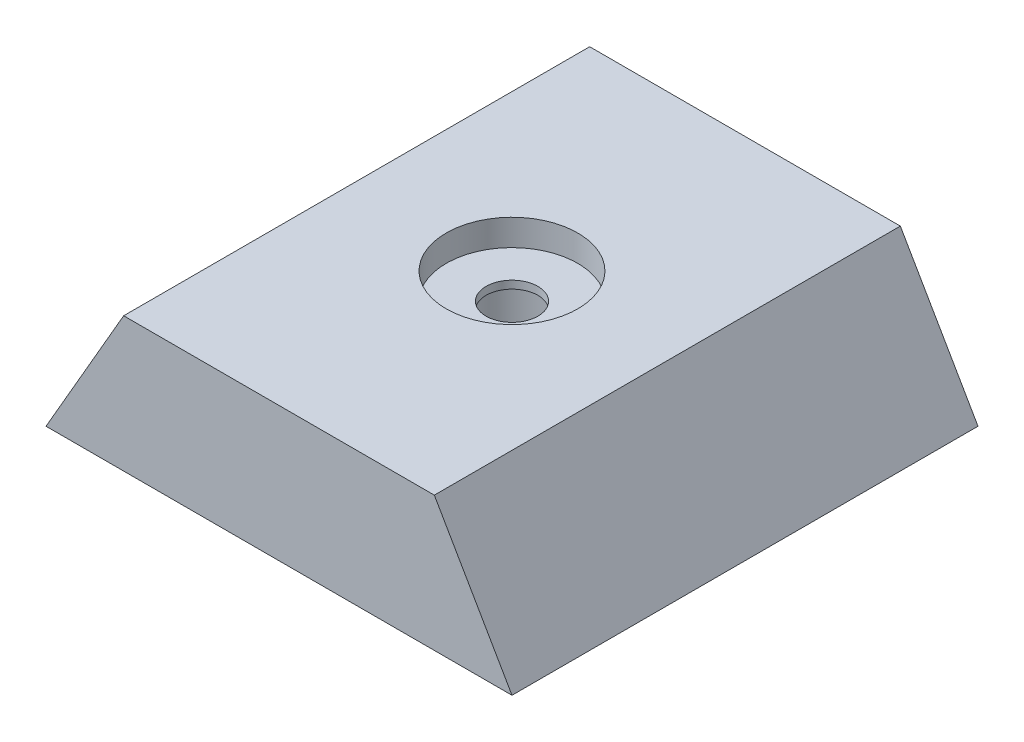
ISO-10303-21;
HEADER;
FILE_DESCRIPTION(('STEP AP214'),'2;1');
FILE_NAME('part.step','',(''),(''),'','','');
FILE_SCHEMA(('AUTOMOTIVE_DESIGN { 1 0 10303 214 1 1 1 1 }'));
ENDSEC;
DATA;
#1=APPLICATION_CONTEXT('core data for automotive mechanical design processes');
#2=APPLICATION_PROTOCOL_DEFINITION('international standard','automotive_design',2000,#1);
#3=PRODUCT_CONTEXT('',#1,'mechanical');
#4=PRODUCT('Part','Part','',(#3));
#5=PRODUCT_RELATED_PRODUCT_CATEGORY('part','',(#4));
#6=PRODUCT_DEFINITION_FORMATION('','',#4);
#7=PRODUCT_DEFINITION_CONTEXT('part definition',#1,'design');
#8=PRODUCT_DEFINITION('design','',#6,#7);
#9=PRODUCT_DEFINITION_SHAPE('','',#8);
#10=(LENGTH_UNIT() NAMED_UNIT(*) SI_UNIT(.MILLI.,.METRE.));
#11=(NAMED_UNIT(*) PLANE_ANGLE_UNIT() SI_UNIT($,.RADIAN.));
#12=(NAMED_UNIT(*) SI_UNIT($,.STERADIAN.) SOLID_ANGLE_UNIT());
#13=UNCERTAINTY_MEASURE_WITH_UNIT(LENGTH_MEASURE(1.E-05),#10,'distance_accuracy_value','');
#14=(GEOMETRIC_REPRESENTATION_CONTEXT(3) GLOBAL_UNCERTAINTY_ASSIGNED_CONTEXT((#13)) GLOBAL_UNIT_ASSIGNED_CONTEXT((#10,
#11,#12)) REPRESENTATION_CONTEXT('',''));
#15=CARTESIAN_POINT('',(0.,0.,0.));
#16=DIRECTION('',(0.,0.,1.));
#17=DIRECTION('',(1.,0.,0.));
#18=AXIS2_PLACEMENT_3D('',#15,#16,#17);
#19=CARTESIAN_POINT('',(0.,0.,450.));
#20=DIRECTION('',(0.,1.,0.));
#21=DIRECTION('',(0.,0.,1.));
#22=AXIS2_PLACEMENT_3D('',#19,#20,#21);
#23=PLANE('',#22);
#24=DIRECTION('',(1.,0.,0.));
#25=VECTOR('',#24,1.);
#26=CARTESIAN_POINT('',(0.,0.,0.));
#27=LINE('',#26,#25);
#28=CARTESIAN_POINT('',(0.,0.,0.));
#29=VERTEX_POINT('',#28);
#30=CARTESIAN_POINT('',(450.,0.,0.));
#31=VERTEX_POINT('',#30);
#32=EDGE_CURVE('E214',#29,#31,#27,.T.);
#33=ORIENTED_EDGE('',*,*,#32,.T.);
#34=DIRECTION('',(0.,0.,-1.));
#35=VECTOR('',#34,1.);
#36=CARTESIAN_POINT('',(450.,0.,450.));
#37=LINE('',#36,#35);
#38=CARTESIAN_POINT('',(450.,0.,450.));
#39=VERTEX_POINT('',#38);
#40=EDGE_CURVE('E51',#39,#31,#37,.T.);
#41=ORIENTED_EDGE('',*,*,#40,.F.);
#42=DIRECTION('',(1.,0.,0.));
#43=VECTOR('',#42,1.);
#44=CARTESIAN_POINT('',(0.,0.,450.));
#45=LINE('',#44,#43);
#46=CARTESIAN_POINT('',(0.,0.,450.));
#47=VERTEX_POINT('',#46);
#48=EDGE_CURVE('E95',#47,#39,#45,.T.);
#49=ORIENTED_EDGE('',*,*,#48,.F.);
#50=DIRECTION('',(0.,0.,-1.));
#51=VECTOR('',#50,1.);
#52=CARTESIAN_POINT('',(0.,0.,450.));
#53=LINE('',#52,#51);
#54=EDGE_CURVE('E11',#47,#29,#53,.T.);
#55=ORIENTED_EDGE('',*,*,#54,.T.);
#56=EDGE_LOOP('',(#33,#41,#49,#55));
#57=FACE_BOUND('',#56,.T.);
#58=DIRECTION('',(1.,0.,0.));
#59=VECTOR('',#58,1.);
#60=CARTESIAN_POINT('',(0.,0.,30.));
#61=LINE('',#60,#59);
#62=CARTESIAN_POINT('',(34.6410161513777,0.,30.));
#63=VERTEX_POINT('',#62);
#64=CARTESIAN_POINT('',(415.358983848623,0.,30.));
#65=VERTEX_POINT('',#64);
#66=EDGE_CURVE('E142',#63,#65,#61,.T.);
#67=ORIENTED_EDGE('',*,*,#66,.F.);
#68=DIRECTION('',(0.,0.,-1.));
#69=VECTOR('',#68,1.);
#70=CARTESIAN_POINT('',(34.6410161513777,0.,450.));
#71=LINE('',#70,#69);
#72=CARTESIAN_POINT('',(34.6410161513777,0.,420.));
#73=VERTEX_POINT('',#72);
#74=EDGE_CURVE('E140',#73,#63,#71,.T.);
#75=ORIENTED_EDGE('',*,*,#74,.F.);
#76=DIRECTION('',(1.,0.,0.));
#77=VECTOR('',#76,1.);
#78=CARTESIAN_POINT('',(0.,0.,420.));
#79=LINE('',#78,#77);
#80=CARTESIAN_POINT('',(415.358983848623,0.,420.));
#81=VERTEX_POINT('',#80);
#82=EDGE_CURVE('E156',#73,#81,#79,.T.);
#83=ORIENTED_EDGE('',*,*,#82,.T.);
#84=DIRECTION('',(0.,0.,-1.));
#85=VECTOR('',#84,1.);
#86=CARTESIAN_POINT('',(415.358983848623,0.,450.));
#87=LINE('',#86,#85);
#88=EDGE_CURVE('E164',#81,#65,#87,.T.);
#89=ORIENTED_EDGE('',*,*,#88,.T.);
#90=EDGE_LOOP('',(#67,#75,#83,#89));
#91=FACE_BOUND('',#90,.T.);
#92=ADVANCED_FACE('F41',(#57,#91),#23,.F.);
#93=CARTESIAN_POINT('',(225.,84.5038105676655,225.));
#94=DIRECTION('',(0.,1.,0.));
#95=DIRECTION('',(0.,0.,1.));
#96=AXIS2_PLACEMENT_3D('',#93,#94,#95);
#97=CYLINDRICAL_SURFACE('',#96,25.);
#98=CARTESIAN_POINT('',(225.,104.503810567665,225.));
#99=DIRECTION('',(0.,1.,0.));
#100=DIRECTION('',(0.,0.,1.));
#101=AXIS2_PLACEMENT_3D('',#98,#99,#100);
#102=CIRCLE('',#101,25.);
#103=CARTESIAN_POINT('',(225.,104.503810567665,250.));
#104=VERTEX_POINT('',#103);
#105=EDGE_CURVE('E187',#104,#104,#102,.T.);
#106=ORIENTED_EDGE('',*,*,#105,.T.);
#107=EDGE_LOOP('',(#106));
#108=FACE_BOUND('',#107,.T.);
#109=CARTESIAN_POINT('',(225.,97.,225.));
#110=DIRECTION('',(0.,-1.,0.));
#111=DIRECTION('',(0.,0.,-1.));
#112=AXIS2_PLACEMENT_3D('',#109,#110,#111);
#113=CIRCLE('',#112,25.);
#114=CARTESIAN_POINT('',(225.,97.,200.));
#115=VERTEX_POINT('',#114);
#116=EDGE_CURVE('E45',#115,#115,#113,.F.);
#117=ORIENTED_EDGE('',*,*,#116,.F.);
#118=EDGE_LOOP('',(#117));
#119=FACE_BOUND('',#118,.T.);
#120=ADVANCED_FACE('F255',(#108,#119),#97,.F.);
#121=CARTESIAN_POINT('',(75.0000000000006,129.903810567665,450.));
#122=DIRECTION('',(0.866025403784437,-0.500000000000004,0.));
#123=DIRECTION('',(0.500000000000004,0.866025403784437,0.));
#124=AXIS2_PLACEMENT_3D('',#121,#122,#123);
#125=PLANE('',#124);
#126=DIRECTION('',(-0.500000000000004,-0.866025403784436,0.));
#127=VECTOR('',#126,1.);
#128=CARTESIAN_POINT('',(75.0000000000006,129.903810567665,0.));
#129=LINE('',#128,#127);
#130=CARTESIAN_POINT('',(75.0000000000006,129.903810567665,0.));
#131=VERTEX_POINT('',#130);
#132=EDGE_CURVE('E196',#131,#29,#129,.T.);
#133=ORIENTED_EDGE('',*,*,#132,.T.);
#134=ORIENTED_EDGE('',*,*,#54,.F.);
#135=DIRECTION('',(-0.500000000000004,-0.866025403784436,0.));
#136=VECTOR('',#135,1.);
#137=CARTESIAN_POINT('',(75.0000000000006,129.903810567665,450.));
#138=LINE('',#137,#136);
#139=CARTESIAN_POINT('',(75.0000000000006,129.903810567665,450.));
#140=VERTEX_POINT('',#139);
#141=EDGE_CURVE('E200',#140,#47,#138,.T.);
#142=ORIENTED_EDGE('',*,*,#141,.F.);
#143=DIRECTION('',(0.,0.,-1.));
#144=VECTOR('',#143,1.);
#145=CARTESIAN_POINT('',(75.0000000000006,129.903810567665,450.));
#146=LINE('',#145,#144);
#147=EDGE_CURVE('E210',#140,#131,#146,.T.);
#148=ORIENTED_EDGE('',*,*,#147,.T.);
#149=EDGE_LOOP('',(#133,#134,#142,#148));
#150=FACE_BOUND('',#149,.T.);
#151=ADVANCED_FACE('F43',(#150),#125,.F.);
#152=CARTESIAN_POINT('',(225.,0.,225.));
#153=DIRECTION('',(0.,1.,0.));
#154=DIRECTION('',(0.,0.,1.));
#155=AXIS2_PLACEMENT_3D('',#152,#153,#154);
#156=CIRCLE('',#155,80.);
#157=CARTESIAN_POINT('',(225.,0.,145.));
#158=VERTEX_POINT('',#157);
#159=EDGE_CURVE('E172',#158,#158,#156,.F.);
#160=ORIENTED_EDGE('',*,*,#159,.T.);
#161=EDGE_LOOP('',(#160));
#162=FACE_BOUND('',#161,.T.);
#163=CARTESIAN_POINT('',(225.,0.,225.));
#164=DIRECTION('',(0.,-1.,0.));
#165=DIRECTION('',(0.,0.,-1.));
#166=AXIS2_PLACEMENT_3D('',#163,#164,#165);
#167=CIRCLE('',#166,50.);
#168=CARTESIAN_POINT('',(225.,0.,175.));
#169=VERTEX_POINT('',#168);
#170=EDGE_CURVE('E179',#169,#169,#167,.T.);
#171=ORIENTED_EDGE('',*,*,#170,.F.);
#172=EDGE_LOOP('',(#171));
#173=FACE_BOUND('',#172,.T.);
#174=ADVANCED_FACE('F250',(#162,#173),#23,.F.);
#175=CARTESIAN_POINT('',(375.000000000001,129.903810567665,450.));
#176=DIRECTION('',(-0.86602540378444,-0.499999999999998,0.));
#177=DIRECTION('',(0.499999999999998,-0.86602540378444,0.));
#178=AXIS2_PLACEMENT_3D('',#175,#176,#177);
#179=PLANE('',#178);
#180=DIRECTION('',(-0.499999999999998,0.86602540378444,0.));
#181=VECTOR('',#180,1.);
#182=CARTESIAN_POINT('',(375.000000000001,129.903810567665,0.));
#183=LINE('',#182,#181);
#184=CARTESIAN_POINT('',(375.000000000001,129.903810567665,0.));
#185=VERTEX_POINT('',#184);
#186=EDGE_CURVE('E217',#31,#185,#183,.T.);
#187=ORIENTED_EDGE('',*,*,#186,.T.);
#188=DIRECTION('',(0.,0.,-1.));
#189=VECTOR('',#188,1.);
#190=CARTESIAN_POINT('',(375.000000000001,129.903810567665,450.));
#191=LINE('',#190,#189);
#192=CARTESIAN_POINT('',(375.000000000001,129.903810567665,450.));
#193=VERTEX_POINT('',#192);
#194=EDGE_CURVE('E224',#193,#185,#191,.T.);
#195=ORIENTED_EDGE('',*,*,#194,.F.);
#196=DIRECTION('',(-0.499999999999998,0.86602540378444,0.));
#197=VECTOR('',#196,1.);
#198=CARTESIAN_POINT('',(375.000000000001,129.903810567665,450.));
#199=LINE('',#198,#197);
#200=EDGE_CURVE('E205',#39,#193,#199,.T.);
#201=ORIENTED_EDGE('',*,*,#200,.F.);
#202=ORIENTED_EDGE('',*,*,#40,.T.);
#203=EDGE_LOOP('',(#187,#195,#201,#202));
#204=FACE_BOUND('',#203,.T.);
#205=ADVANCED_FACE('F232',(#204),#179,.F.);
#206=CARTESIAN_POINT('',(75.0000000000006,129.903810567665,450.));
#207=DIRECTION('',(0.,-1.,0.));
#208=DIRECTION('',(1.,0.,0.));
#209=AXIS2_PLACEMENT_3D('',#206,#207,#208);
#210=PLANE('',#209);
#211=CARTESIAN_POINT('',(225.,129.903810567665,225.));
#212=DIRECTION('',(0.,1.,0.));
#213=DIRECTION('',(0.,0.,1.));
#214=AXIS2_PLACEMENT_3D('',#211,#212,#213);
#215=CIRCLE('',#214,63.5);
#216=CARTESIAN_POINT('',(225.,129.903810567665,288.5));
#217=VERTEX_POINT('',#216);
#218=EDGE_CURVE('E191',#217,#217,#215,.T.);
#219=ORIENTED_EDGE('',*,*,#218,.F.);
#220=EDGE_LOOP('',(#219));
#221=FACE_BOUND('',#220,.T.);
#222=DIRECTION('',(-1.,0.,0.));
#223=VECTOR('',#222,1.);
#224=CARTESIAN_POINT('',(75.0000000000006,129.903810567665,0.));
#225=LINE('',#224,#223);
#226=EDGE_CURVE('E88',#185,#131,#225,.T.);
#227=ORIENTED_EDGE('',*,*,#226,.T.);
#228=ORIENTED_EDGE('',*,*,#147,.F.);
#229=DIRECTION('',(-1.,0.,0.));
#230=VECTOR('',#229,1.);
#231=CARTESIAN_POINT('',(75.0000000000006,129.903810567665,450.));
#232=LINE('',#231,#230);
#233=EDGE_CURVE('E67',#193,#140,#232,.T.);
#234=ORIENTED_EDGE('',*,*,#233,.F.);
#235=ORIENTED_EDGE('',*,*,#194,.T.);
#236=EDGE_LOOP('',(#227,#228,#234,#235));
#237=FACE_BOUND('',#236,.T.);
#238=ADVANCED_FACE('F240',(#221,#237),#210,.F.);
#239=CARTESIAN_POINT('',(0.,0.,450.));
#240=DIRECTION('',(0.,0.,1.));
#241=DIRECTION('',(1.,0.,0.));
#242=AXIS2_PLACEMENT_3D('',#239,#240,#241);
#243=PLANE('',#242);
#244=ORIENTED_EDGE('',*,*,#141,.T.);
#245=ORIENTED_EDGE('',*,*,#48,.T.);
#246=ORIENTED_EDGE('',*,*,#200,.T.);
#247=ORIENTED_EDGE('',*,*,#233,.T.);
#248=EDGE_LOOP('',(#244,#245,#246,#247));
#249=FACE_BOUND('',#248,.T.);
#250=ADVANCED_FACE('F242',(#249),#243,.T.);
#251=CARTESIAN_POINT('',(0.,0.,0.));
#252=DIRECTION('',(0.,0.,1.));
#253=DIRECTION('',(1.,0.,0.));
#254=AXIS2_PLACEMENT_3D('',#251,#252,#253);
#255=PLANE('',#254);
#256=ORIENTED_EDGE('',*,*,#132,.F.);
#257=ORIENTED_EDGE('',*,*,#226,.F.);
#258=ORIENTED_EDGE('',*,*,#186,.F.);
#259=ORIENTED_EDGE('',*,*,#32,.F.);
#260=EDGE_LOOP('',(#256,#257,#258,#259));
#261=FACE_BOUND('',#260,.T.);
#262=ADVANCED_FACE('F236',(#261),#255,.F.);
#263=CARTESIAN_POINT('',(225.,104.503810567665,225.));
#264=DIRECTION('',(0.,1.,0.));
#265=DIRECTION('',(0.,0.,1.));
#266=AXIS2_PLACEMENT_3D('',#263,#264,#265);
#267=CYLINDRICAL_SURFACE('',#266,63.5);
#268=CARTESIAN_POINT('',(225.,104.503810567665,225.));
#269=DIRECTION('',(0.,1.,0.));
#270=DIRECTION('',(0.,0.,1.));
#271=AXIS2_PLACEMENT_3D('',#268,#269,#270);
#272=CIRCLE('',#271,63.5);
#273=CARTESIAN_POINT('',(225.,104.503810567665,288.5));
#274=VERTEX_POINT('',#273);
#275=EDGE_CURVE('E192',#274,#274,#272,.T.);
#276=ORIENTED_EDGE('',*,*,#275,.F.);
#277=EDGE_LOOP('',(#276));
#278=FACE_BOUND('',#277,.T.);
#279=ORIENTED_EDGE('',*,*,#218,.T.);
#280=EDGE_LOOP('',(#279));
#281=FACE_BOUND('',#280,.T.);
#282=ADVANCED_FACE('F290',(#278,#281),#267,.F.);
#283=CARTESIAN_POINT('',(225.,104.503810567665,225.));
#284=DIRECTION('',(0.,1.,0.));
#285=DIRECTION('',(0.,0.,1.));
#286=AXIS2_PLACEMENT_3D('',#283,#284,#285);
#287=PLANE('',#286);
#288=ORIENTED_EDGE('',*,*,#105,.F.);
#289=EDGE_LOOP('',(#288));
#290=FACE_BOUND('',#289,.T.);
#291=ORIENTED_EDGE('',*,*,#275,.T.);
#292=EDGE_LOOP('',(#291));
#293=FACE_BOUND('',#292,.T.);
#294=ADVANCED_FACE('F283',(#290,#293),#287,.T.);
#295=CARTESIAN_POINT('',(225.,97.,225.));
#296=DIRECTION('',(0.,-1.,0.));
#297=DIRECTION('',(0.,0.,-1.));
#298=AXIS2_PLACEMENT_3D('',#295,#296,#297);
#299=PLANE('',#298);
#300=CARTESIAN_POINT('',(225.,97.,225.));
#301=DIRECTION('',(0.,-1.,0.));
#302=DIRECTION('',(0.,0.,-1.));
#303=AXIS2_PLACEMENT_3D('',#300,#301,#302);
#304=CIRCLE('',#303,50.);
#305=CARTESIAN_POINT('',(225.,97.,175.));
#306=VERTEX_POINT('',#305);
#307=EDGE_CURVE('E180',#306,#306,#304,.T.);
#308=ORIENTED_EDGE('',*,*,#307,.T.);
#309=EDGE_LOOP('',(#308));
#310=FACE_BOUND('',#309,.T.);
#311=ORIENTED_EDGE('',*,*,#116,.T.);
#312=EDGE_LOOP('',(#311));
#313=FACE_BOUND('',#312,.T.);
#314=ADVANCED_FACE('F274',(#310,#313),#299,.T.);
#315=CARTESIAN_POINT('',(225.,97.,225.));
#316=DIRECTION('',(0.,-1.,0.));
#317=DIRECTION('',(0.,0.,-1.));
#318=AXIS2_PLACEMENT_3D('',#315,#316,#317);
#319=CYLINDRICAL_SURFACE('',#318,50.);
#320=CARTESIAN_POINT('',(225.,97.,175.));
#321=CARTESIAN_POINT('',(225.,95.9895833333334,175.));
#322=CARTESIAN_POINT('',(225.,94.9791666666667,175.));
#323=CARTESIAN_POINT('',(225.,92.9583333333333,175.));
#324=CARTESIAN_POINT('',(225.,91.9479166666667,175.));
#325=CARTESIAN_POINT('',(225.,89.9270833333333,175.));
#326=CARTESIAN_POINT('',(225.,88.9166666666667,175.));
#327=CARTESIAN_POINT('',(225.,86.8958333333333,175.));
#328=CARTESIAN_POINT('',(225.,85.8854166666667,175.));
#329=CARTESIAN_POINT('',(225.,83.8645833333333,175.));
#330=CARTESIAN_POINT('',(225.,82.8541666666667,175.));
#331=CARTESIAN_POINT('',(225.,80.8333333333333,175.));
#332=CARTESIAN_POINT('',(225.,79.8229166666667,175.));
#333=CARTESIAN_POINT('',(225.,77.8020833333333,175.));
#334=CARTESIAN_POINT('',(225.,76.7916666666667,175.));
#335=CARTESIAN_POINT('',(225.,74.7708333333333,175.));
#336=CARTESIAN_POINT('',(225.,73.7604166666667,175.));
#337=CARTESIAN_POINT('',(225.,71.7395833333333,175.));
#338=CARTESIAN_POINT('',(225.,70.7291666666667,175.));
#339=CARTESIAN_POINT('',(225.,68.7083333333333,175.));
#340=CARTESIAN_POINT('',(225.,67.6979166666667,175.));
#341=CARTESIAN_POINT('',(225.,65.6770833333333,175.));
#342=CARTESIAN_POINT('',(225.,64.6666666666667,175.));
#343=CARTESIAN_POINT('',(225.,62.6458333333333,175.));
#344=CARTESIAN_POINT('',(225.,61.6354166666667,175.));
#345=CARTESIAN_POINT('',(225.,59.6145833333333,175.));
#346=CARTESIAN_POINT('',(225.,58.6041666666667,175.));
#347=CARTESIAN_POINT('',(225.,56.5833333333333,175.));
#348=CARTESIAN_POINT('',(225.,55.5729166666667,175.));
#349=CARTESIAN_POINT('',(225.,53.5520833333333,175.));
#350=CARTESIAN_POINT('',(225.,52.5416666666667,175.));
#351=CARTESIAN_POINT('',(225.,50.5208333333333,175.));
#352=CARTESIAN_POINT('',(225.,49.5104166666667,175.));
#353=CARTESIAN_POINT('',(225.,47.4895833333333,175.));
#354=CARTESIAN_POINT('',(225.,46.4791666666667,175.));
#355=CARTESIAN_POINT('',(225.,44.4583333333333,175.));
#356=CARTESIAN_POINT('',(225.,43.4479166666667,175.));
#357=CARTESIAN_POINT('',(225.,41.4270833333333,175.));
#358=CARTESIAN_POINT('',(225.,40.4166666666667,175.));
#359=CARTESIAN_POINT('',(225.,38.3958333333333,175.));
#360=CARTESIAN_POINT('',(225.,37.3854166666667,175.));
#361=CARTESIAN_POINT('',(225.,35.3645833333333,175.));
#362=CARTESIAN_POINT('',(225.,34.3541666666667,175.));
#363=CARTESIAN_POINT('',(225.,32.3333333333333,175.));
#364=CARTESIAN_POINT('',(225.,31.3229166666667,175.));
#365=CARTESIAN_POINT('',(225.,29.3020833333334,175.));
#366=CARTESIAN_POINT('',(225.,28.2916666666667,175.));
#367=CARTESIAN_POINT('',(225.,26.2708333333334,175.));
#368=CARTESIAN_POINT('',(225.,25.2604166666667,175.));
#369=CARTESIAN_POINT('',(225.,23.2395833333334,175.));
#370=CARTESIAN_POINT('',(225.,22.2291666666667,175.));
#371=CARTESIAN_POINT('',(225.,20.2083333333334,175.));
#372=CARTESIAN_POINT('',(225.,19.1979166666667,175.));
#373=CARTESIAN_POINT('',(225.,17.1770833333334,175.));
#374=CARTESIAN_POINT('',(225.,16.1666666666667,175.));
#375=CARTESIAN_POINT('',(225.,14.1458333333333,175.));
#376=CARTESIAN_POINT('',(225.,13.1354166666667,175.));
#377=CARTESIAN_POINT('',(225.,11.1145833333333,175.));
#378=CARTESIAN_POINT('',(225.,10.1041666666667,175.));
#379=CARTESIAN_POINT('',(225.,8.08333333333334,175.));
#380=CARTESIAN_POINT('',(225.,7.07291666666668,175.));
#381=CARTESIAN_POINT('',(225.,5.05208333333335,175.));
#382=CARTESIAN_POINT('',(225.,4.04166666666668,175.));
#383=CARTESIAN_POINT('',(225.,2.02083333333335,175.));
#384=CARTESIAN_POINT('',(225.,1.01041666666668,175.));
#385=CARTESIAN_POINT('',(225.,0.,175.));
#386=B_SPLINE_CURVE_WITH_KNOTS('',3,(#320,#321,#322,#323,#324,#325,#326,#327,#328,#329,#330,
#331,#332,#333,#334,#335,#336,#337,#338,#339,#340,#341,#342,#343,#344,#345,#346,#347,#348,#349,
#350,#351,#352,#353,#354,#355,#356,#357,#358,#359,#360,#361,#362,#363,#364,#365,#366,#367,#368,
#369,#370,#371,#372,#373,#374,#375,#376,#377,#378,#379,#380,#381,#382,#383,#384,#385),
.UNSPECIFIED.,.F.,.F.,(4,2,2,2,2,2,2,2,2,2,2,2,2,2,2,2,2,2,2,2,2,2,2,2,2,2,2,2,2,2,2,2,4),(0.,
3.03125000000001,6.06250000000001,9.09375000000001,12.125,15.15625,18.1875,21.21875,24.25,
27.28125,30.3125,33.34375,36.375,39.40625,42.4375,45.46875,48.5,51.53125,54.5625,57.59375,
60.625,63.65625,66.6875,69.71875,72.75,75.78125,78.8125,81.84375,84.875,87.90625,90.9375,
93.96875,97.),.UNSPECIFIED.);
#387=EDGE_CURVE('BSEAM271',#306,#169,#386,.T.);
#388=ORIENTED_EDGE('',*,*,#307,.F.);
#389=ORIENTED_EDGE('',*,*,#170,.T.);
#390=ORIENTED_EDGE('',*,*,#387,.T.);
#391=ORIENTED_EDGE('',*,*,#387,.F.);
#392=EDGE_LOOP('',(#388,#390,#389,#391));
#393=FACE_BOUND('',#392,.T.);
#394=ADVANCED_FACE('F271',(#393),#319,.F.);
#395=CARTESIAN_POINT('',(225.,97.,225.));
#396=DIRECTION('',(0.,-1.,0.));
#397=DIRECTION('',(0.,0.,-1.));
#398=AXIS2_PLACEMENT_3D('',#395,#396,#397);
#399=CYLINDRICAL_SURFACE('',#398,80.);
#400=CARTESIAN_POINT('',(225.,74.5038105676655,225.));
#401=DIRECTION('',(0.,1.,0.));
#402=DIRECTION('',(0.,0.,1.));
#403=AXIS2_PLACEMENT_3D('',#400,#401,#402);
#404=CIRCLE('',#403,80.);
#405=CARTESIAN_POINT('',(225.,74.5038105676655,145.));
#406=VERTEX_POINT('',#405);
#407=EDGE_CURVE('E163',#406,#406,#404,.T.);
#408=CARTESIAN_POINT('',(225.,0.,145.));
#409=CARTESIAN_POINT('',(225.,0.776081360079834,145.));
#410=CARTESIAN_POINT('',(225.,1.55216272015968,145.));
#411=CARTESIAN_POINT('',(225.,3.10432544031938,145.));
#412=CARTESIAN_POINT('',(225.,3.88040680039923,145.));
#413=CARTESIAN_POINT('',(225.,5.43256952055892,145.));
#414=CARTESIAN_POINT('',(225.,6.20865088063877,145.));
#415=CARTESIAN_POINT('',(225.,7.76081360079847,145.));
#416=CARTESIAN_POINT('',(225.,8.53689496087832,145.));
#417=CARTESIAN_POINT('',(225.,10.089057681038,145.));
#418=CARTESIAN_POINT('',(225.,10.8651390411179,145.));
#419=CARTESIAN_POINT('',(225.,12.4173017612776,145.));
#420=CARTESIAN_POINT('',(225.,13.1933831213574,145.));
#421=CARTESIAN_POINT('',(225.,14.7455458415171,145.));
#422=CARTESIAN_POINT('',(225.,15.521627201597,145.));
#423=CARTESIAN_POINT('',(225.,17.0737899217567,145.));
#424=CARTESIAN_POINT('',(225.,17.8498712818365,145.));
#425=CARTESIAN_POINT('',(225.,19.4020340019962,145.));
#426=CARTESIAN_POINT('',(225.,20.1781153620761,145.));
#427=CARTESIAN_POINT('',(225.,21.7302780822358,145.));
#428=CARTESIAN_POINT('',(225.,22.5063594423156,145.));
#429=CARTESIAN_POINT('',(225.,24.0585221624753,145.));
#430=CARTESIAN_POINT('',(225.,24.8346035225552,145.));
#431=CARTESIAN_POINT('',(225.,26.3867662427149,145.));
#432=CARTESIAN_POINT('',(225.,27.1628476027947,145.));
#433=CARTESIAN_POINT('',(225.,28.7150103229544,145.));
#434=CARTESIAN_POINT('',(225.,29.4910916830342,145.));
#435=CARTESIAN_POINT('',(225.,31.0432544031939,145.));
#436=CARTESIAN_POINT('',(225.,31.8193357632738,145.));
#437=CARTESIAN_POINT('',(225.,33.3714984834335,145.));
#438=CARTESIAN_POINT('',(225.,34.1475798435133,145.));
#439=CARTESIAN_POINT('',(225.,35.699742563673,145.));
#440=CARTESIAN_POINT('',(225.,36.4758239237529,145.));
#441=CARTESIAN_POINT('',(225.,38.0279866439126,145.));
#442=CARTESIAN_POINT('',(225.,38.8040680039924,145.));
#443=CARTESIAN_POINT('',(225.,40.3562307241521,145.));
#444=CARTESIAN_POINT('',(225.,41.132312084232,145.));
#445=CARTESIAN_POINT('',(225.,42.6844748043917,145.));
#446=CARTESIAN_POINT('',(225.,43.4605561644715,145.));
#447=CARTESIAN_POINT('',(225.,45.0127188846312,145.));
#448=CARTESIAN_POINT('',(225.,45.7888002447111,145.));
#449=CARTESIAN_POINT('',(225.,47.3409629648708,145.));
#450=CARTESIAN_POINT('',(225.,48.1170443249506,145.));
#451=CARTESIAN_POINT('',(225.,49.6692070451103,145.));
#452=CARTESIAN_POINT('',(225.,50.4452884051902,145.));
#453=CARTESIAN_POINT('',(225.,51.9974511253498,145.));
#454=CARTESIAN_POINT('',(225.,52.7735324854297,145.));
#455=CARTESIAN_POINT('',(225.,54.3256952055894,145.));
#456=CARTESIAN_POINT('',(225.,55.1017765656692,145.));
#457=CARTESIAN_POINT('',(225.,56.6539392858289,145.));
#458=CARTESIAN_POINT('',(225.,57.4300206459088,145.));
#459=CARTESIAN_POINT('',(225.,58.9821833660685,145.));
#460=CARTESIAN_POINT('',(225.,59.7582647261483,145.));
#461=CARTESIAN_POINT('',(225.,61.310427446308,145.));
#462=CARTESIAN_POINT('',(225.,62.0865088063879,145.));
#463=CARTESIAN_POINT('',(225.,63.6386715265476,145.));
#464=CARTESIAN_POINT('',(225.,64.4147528866274,145.));
#465=CARTESIAN_POINT('',(225.,65.9669156067871,145.));
#466=CARTESIAN_POINT('',(225.,66.742996966867,145.));
#467=CARTESIAN_POINT('',(225.,68.2951596870267,145.));
#468=CARTESIAN_POINT('',(225.,69.0712410471065,145.));
#469=CARTESIAN_POINT('',(225.,70.6234037672662,145.));
#470=CARTESIAN_POINT('',(225.,71.3994851273461,145.));
#471=CARTESIAN_POINT('',(225.,72.9516478475058,145.));
#472=CARTESIAN_POINT('',(225.,73.7277292075856,145.));
#473=CARTESIAN_POINT('',(225.,74.5038105676655,145.));
#474=B_SPLINE_CURVE_WITH_KNOTS('',3,(#408,#409,#410,#411,#412,#413,#414,#415,#416,#417,#418,
#419,#420,#421,#422,#423,#424,#425,#426,#427,#428,#429,#430,#431,#432,#433,#434,#435,#436,#437,
#438,#439,#440,#441,#442,#443,#444,#445,#446,#447,#448,#449,#450,#451,#452,#453,#454,#455,#456,
#457,#458,#459,#460,#461,#462,#463,#464,#465,#466,#467,#468,#469,#470,#471,#472,#473),
.UNSPECIFIED.,.F.,.F.,(4,2,2,2,2,2,2,2,2,2,2,2,2,2,2,2,2,2,2,2,2,2,2,2,2,2,2,2,2,2,2,2,4),(0.,
2.32824408023954,4.65648816047909,6.98473224071863,9.31297632095819,11.6412204011977,
13.9694644814373,16.2977085616768,18.6259526419164,20.9541967221559,23.2824408023955,
25.610684882635,27.9389289628746,30.2671730431141,32.5954171233536,34.9236612035932,
37.2519052838327,39.5801493640723,41.9083934443118,44.2366375245514,46.5648816047909,
48.8931256850305,51.22136976527,53.5496138455096,55.8778579257491,58.2061020059887,
60.5343460862282,62.8625901664677,65.1908342467073,67.5190783269468,69.8473224071864,
72.1755664874259,74.5038105676655),.UNSPECIFIED.);
#475=EDGE_CURVE('BSEAM273',#158,#406,#474,.T.);
#476=ORIENTED_EDGE('',*,*,#159,.F.);
#477=ORIENTED_EDGE('',*,*,#407,.F.);
#478=ORIENTED_EDGE('',*,*,#475,.T.);
#479=ORIENTED_EDGE('',*,*,#475,.F.);
#480=EDGE_LOOP('',(#476,#478,#477,#479));
#481=FACE_BOUND('',#480,.T.);
#482=ADVANCED_FACE('F273',(#481),#399,.T.);
#483=CARTESIAN_POINT('',(100.980762113534,114.903810567665,450.));
#484=DIRECTION('',(0.866025403784437,-0.500000000000004,0.));
#485=DIRECTION('',(0.500000000000004,0.866025403784437,0.));
#486=AXIS2_PLACEMENT_3D('',#483,#484,#485);
#487=PLANE('',#486);
#488=DIRECTION('',(-0.500000000000004,-0.866025403784437,0.));
#489=VECTOR('',#488,1.);
#490=CARTESIAN_POINT('',(100.980762113534,114.903810567665,30.));
#491=LINE('',#490,#489);
#492=CARTESIAN_POINT('',(92.3205080756893,99.9038105676655,30.));
#493=VERTEX_POINT('',#492);
#494=EDGE_CURVE('E122',#493,#63,#491,.T.);
#495=ORIENTED_EDGE('',*,*,#494,.F.);
#496=DIRECTION('',(0.,0.,-1.));
#497=VECTOR('',#496,1.);
#498=CARTESIAN_POINT('',(92.3205080756893,99.9038105676655,450.));
#499=LINE('',#498,#497);
#500=CARTESIAN_POINT('',(92.3205080756893,99.9038105676655,420.));
#501=VERTEX_POINT('',#500);
#502=EDGE_CURVE('E131',#501,#493,#499,.T.);
#503=ORIENTED_EDGE('',*,*,#502,.F.);
#504=DIRECTION('',(-0.500000000000004,-0.866025403784437,0.));
#505=VECTOR('',#504,1.);
#506=CARTESIAN_POINT('',(100.980762113534,114.903810567665,420.));
#507=LINE('',#506,#505);
#508=EDGE_CURVE('E58',#501,#73,#507,.T.);
#509=ORIENTED_EDGE('',*,*,#508,.T.);
#510=ORIENTED_EDGE('',*,*,#74,.T.);
#511=EDGE_LOOP('',(#495,#503,#509,#510));
#512=FACE_BOUND('',#511,.T.);
#513=ADVANCED_FACE('F138',(#512),#487,.T.);
#514=CARTESIAN_POINT('',(349.019237886467,114.903810567666,450.));
#515=DIRECTION('',(-0.86602540378444,-0.499999999999998,0.));
#516=DIRECTION('',(0.499999999999998,-0.86602540378444,0.));
#517=AXIS2_PLACEMENT_3D('',#514,#515,#516);
#518=PLANE('',#517);
#519=DIRECTION('',(-0.499999999999998,0.86602540378444,0.));
#520=VECTOR('',#519,1.);
#521=CARTESIAN_POINT('',(349.019237886467,114.903810567666,30.));
#522=LINE('',#521,#520);
#523=CARTESIAN_POINT('',(357.679491924312,99.9038105676654,30.));
#524=VERTEX_POINT('',#523);
#525=EDGE_CURVE('E125',#65,#524,#522,.T.);
#526=ORIENTED_EDGE('',*,*,#525,.F.);
#527=ORIENTED_EDGE('',*,*,#88,.F.);
#528=DIRECTION('',(-0.499999999999998,0.86602540378444,0.));
#529=VECTOR('',#528,1.);
#530=CARTESIAN_POINT('',(349.019237886467,114.903810567666,420.));
#531=LINE('',#530,#529);
#532=CARTESIAN_POINT('',(357.679491924312,99.9038105676654,420.));
#533=VERTEX_POINT('',#532);
#534=EDGE_CURVE('E157',#81,#533,#531,.T.);
#535=ORIENTED_EDGE('',*,*,#534,.T.);
#536=DIRECTION('',(0.,0.,-1.));
#537=VECTOR('',#536,1.);
#538=CARTESIAN_POINT('',(357.679491924312,99.9038105676654,450.));
#539=LINE('',#538,#537);
#540=EDGE_CURVE('E136',#533,#524,#539,.T.);
#541=ORIENTED_EDGE('',*,*,#540,.T.);
#542=EDGE_LOOP('',(#526,#527,#535,#541));
#543=FACE_BOUND('',#542,.T.);
#544=ADVANCED_FACE('F346',(#543),#518,.T.);
#545=CARTESIAN_POINT('',(75.0000000000006,99.9038105676655,450.));
#546=DIRECTION('',(0.,-1.,0.));
#547=DIRECTION('',(1.,0.,0.));
#548=AXIS2_PLACEMENT_3D('',#545,#546,#547);
#549=PLANE('',#548);
#550=CARTESIAN_POINT('',(225.,99.9038105676655,225.));
#551=DIRECTION('',(0.,-1.,0.));
#552=DIRECTION('',(1.,0.,0.));
#553=AXIS2_PLACEMENT_3D('',#550,#551,#552);
#554=CIRCLE('',#553,93.5);
#555=CARTESIAN_POINT('',(318.5,99.9038105676654,225.));
#556=VERTEX_POINT('',#555);
#557=EDGE_CURVE('E149',#556,#556,#554,.F.);
#558=ORIENTED_EDGE('',*,*,#557,.T.);
#559=EDGE_LOOP('',(#558));
#560=FACE_BOUND('',#559,.T.);
#561=DIRECTION('',(-1.,0.,0.));
#562=VECTOR('',#561,1.);
#563=CARTESIAN_POINT('',(75.0000000000006,99.9038105676655,30.));
#564=LINE('',#563,#562);
#565=EDGE_CURVE('E118',#524,#493,#564,.T.);
#566=ORIENTED_EDGE('',*,*,#565,.F.);
#567=ORIENTED_EDGE('',*,*,#540,.F.);
#568=DIRECTION('',(-1.,0.,0.));
#569=VECTOR('',#568,1.);
#570=CARTESIAN_POINT('',(75.0000000000006,99.9038105676655,420.));
#571=LINE('',#570,#569);
#572=EDGE_CURVE('E134',#533,#501,#571,.T.);
#573=ORIENTED_EDGE('',*,*,#572,.T.);
#574=ORIENTED_EDGE('',*,*,#502,.T.);
#575=EDGE_LOOP('',(#566,#567,#573,#574));
#576=FACE_BOUND('',#575,.T.);
#577=ADVANCED_FACE('F132',(#560,#576),#549,.T.);
#578=CARTESIAN_POINT('',(0.,0.,420.));
#579=DIRECTION('',(0.,0.,1.));
#580=DIRECTION('',(1.,0.,0.));
#581=AXIS2_PLACEMENT_3D('',#578,#579,#580);
#582=PLANE('',#581);
#583=ORIENTED_EDGE('',*,*,#508,.F.);
#584=ORIENTED_EDGE('',*,*,#572,.F.);
#585=ORIENTED_EDGE('',*,*,#534,.F.);
#586=ORIENTED_EDGE('',*,*,#82,.F.);
#587=EDGE_LOOP('',(#583,#584,#585,#586));
#588=FACE_BOUND('',#587,.T.);
#589=ADVANCED_FACE('F364',(#588),#582,.F.);
#590=CARTESIAN_POINT('',(0.,0.,30.));
#591=DIRECTION('',(0.,0.,1.));
#592=DIRECTION('',(1.,0.,0.));
#593=AXIS2_PLACEMENT_3D('',#590,#591,#592);
#594=PLANE('',#593);
#595=ORIENTED_EDGE('',*,*,#494,.T.);
#596=ORIENTED_EDGE('',*,*,#66,.T.);
#597=ORIENTED_EDGE('',*,*,#525,.T.);
#598=ORIENTED_EDGE('',*,*,#565,.T.);
#599=EDGE_LOOP('',(#595,#596,#597,#598));
#600=FACE_BOUND('',#599,.T.);
#601=ADVANCED_FACE('F120',(#600),#594,.T.);
#602=CARTESIAN_POINT('',(225.,104.503810567665,225.));
#603=DIRECTION('',(0.,1.,0.));
#604=DIRECTION('',(0.,0.,1.));
#605=AXIS2_PLACEMENT_3D('',#602,#603,#604);
#606=CYLINDRICAL_SURFACE('',#605,93.5);
#607=CARTESIAN_POINT('',(225.,74.5038105676655,225.));
#608=DIRECTION('',(0.,1.,0.));
#609=DIRECTION('',(0.,0.,1.));
#610=AXIS2_PLACEMENT_3D('',#607,#608,#609);
#611=CIRCLE('',#610,93.5);
#612=CARTESIAN_POINT('',(225.,74.5038105676655,318.5));
#613=VERTEX_POINT('',#612);
#614=EDGE_CURVE('E143',#613,#613,#611,.T.);
#615=ORIENTED_EDGE('',*,*,#614,.T.);
#616=EDGE_LOOP('',(#615));
#617=FACE_BOUND('',#616,.T.);
#618=ORIENTED_EDGE('',*,*,#557,.F.);
#619=EDGE_LOOP('',(#618));
#620=FACE_BOUND('',#619,.T.);
#621=ADVANCED_FACE('F383',(#617,#620),#606,.T.);
#622=CARTESIAN_POINT('',(225.,74.5038105676655,225.));
#623=DIRECTION('',(0.,1.,0.));
#624=DIRECTION('',(0.,0.,1.));
#625=AXIS2_PLACEMENT_3D('',#622,#623,#624);
#626=PLANE('',#625);
#627=ORIENTED_EDGE('',*,*,#407,.T.);
#628=EDGE_LOOP('',(#627));
#629=FACE_BOUND('',#628,.T.);
#630=ORIENTED_EDGE('',*,*,#614,.F.);
#631=EDGE_LOOP('',(#630));
#632=FACE_BOUND('',#631,.T.);
#633=ADVANCED_FACE('F392',(#629,#632),#626,.F.);
#634=CLOSED_SHELL('',(#92,#120,#151,#174,#205,#238,#250,#262,#282,#294,#314,#394,#482,#513,#544,
#577,#589,#601,#621,#633));
#635=MANIFOLD_SOLID_BREP('B2',#634);
#636=ADVANCED_BREP_SHAPE_REPRESENTATION('',(#18,#635),#14);
#637=SHAPE_DEFINITION_REPRESENTATION(#9,#636);
ENDSEC;
END-ISO-10303-21;
